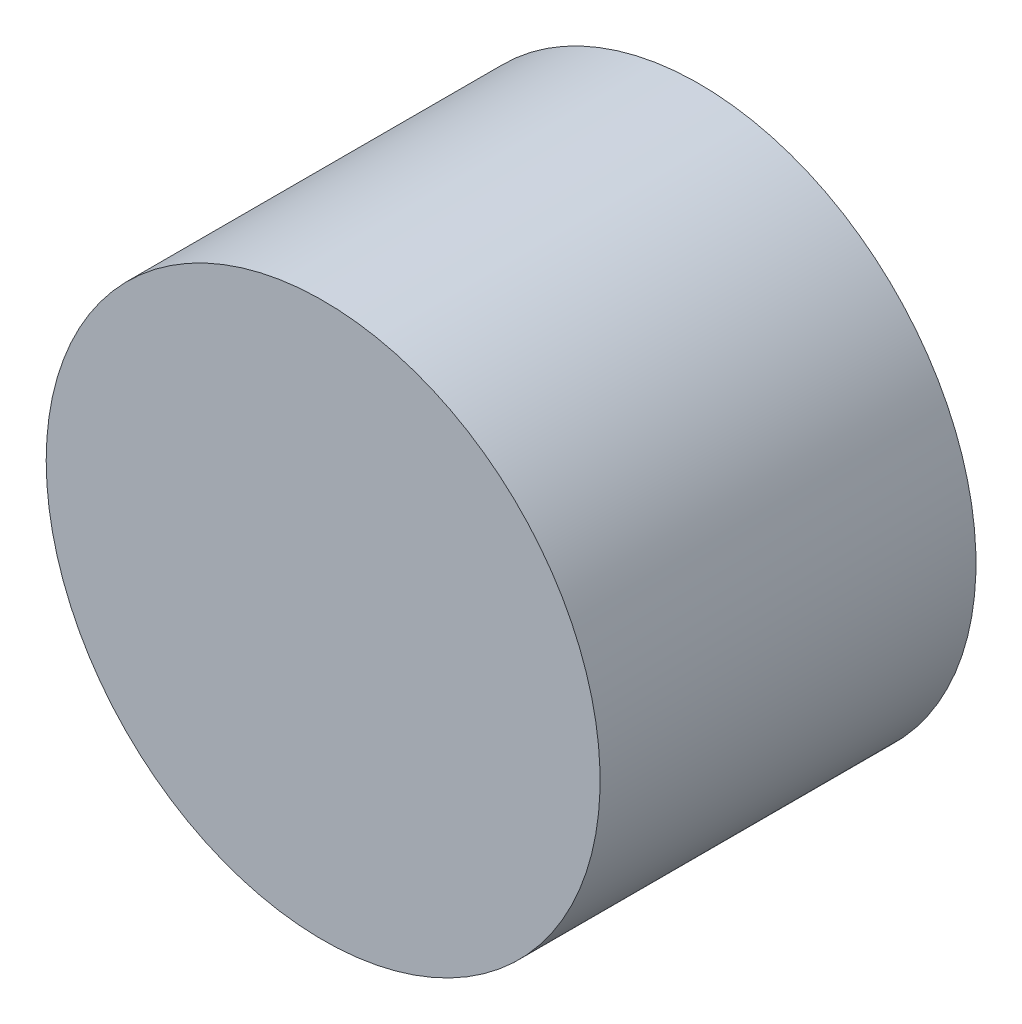
ISO-10303-21;
HEADER;
FILE_DESCRIPTION(('STEP AP214'),'2;1');
FILE_NAME('part.step','',(''),(''),'','','');
FILE_SCHEMA(('AUTOMOTIVE_DESIGN { 1 0 10303 214 1 1 1 1 }'));
ENDSEC;
DATA;
#1=APPLICATION_CONTEXT('core data for automotive mechanical design processes');
#2=APPLICATION_PROTOCOL_DEFINITION('international standard','automotive_design',2000,#1);
#3=PRODUCT_CONTEXT('',#1,'mechanical');
#4=PRODUCT('Part','Part','',(#3));
#5=PRODUCT_RELATED_PRODUCT_CATEGORY('part','',(#4));
#6=PRODUCT_DEFINITION_FORMATION('','',#4);
#7=PRODUCT_DEFINITION_CONTEXT('part definition',#1,'design');
#8=PRODUCT_DEFINITION('design','',#6,#7);
#9=PRODUCT_DEFINITION_SHAPE('','',#8);
#10=(LENGTH_UNIT() NAMED_UNIT(*) SI_UNIT(.MILLI.,.METRE.));
#11=(NAMED_UNIT(*) PLANE_ANGLE_UNIT() SI_UNIT($,.RADIAN.));
#12=(NAMED_UNIT(*) SI_UNIT($,.STERADIAN.) SOLID_ANGLE_UNIT());
#13=UNCERTAINTY_MEASURE_WITH_UNIT(LENGTH_MEASURE(1.E-05),#10,'distance_accuracy_value','');
#14=(GEOMETRIC_REPRESENTATION_CONTEXT(3) GLOBAL_UNCERTAINTY_ASSIGNED_CONTEXT((#13)) GLOBAL_UNIT_ASSIGNED_CONTEXT((#10,
#11,#12)) REPRESENTATION_CONTEXT('',''));
#15=CARTESIAN_POINT('',(0.,0.,0.));
#16=DIRECTION('',(0.,0.,1.));
#17=DIRECTION('',(1.,0.,0.));
#18=AXIS2_PLACEMENT_3D('',#15,#16,#17);
#19=CARTESIAN_POINT('',(0.,0.,3.8));
#20=DIRECTION('',(0.,0.,-1.));
#21=DIRECTION('',(-1.,0.,0.));
#22=AXIS2_PLACEMENT_3D('',#19,#20,#21);
#23=CYLINDRICAL_SURFACE('',#22,2.8);
#24=CARTESIAN_POINT('',(0.,0.,3.8));
#25=DIRECTION('',(0.,0.,1.));
#26=DIRECTION('',(1.,0.,0.));
#27=AXIS2_PLACEMENT_3D('',#24,#25,#26);
#28=CIRCLE('',#27,2.8);
#29=CARTESIAN_POINT('',(-2.8,0.,3.8));
#30=VERTEX_POINT('',#29);
#31=EDGE_CURVE('E10',#30,#30,#28,.T.);
#32=CARTESIAN_POINT('',(0.,0.,0.));
#33=DIRECTION('',(0.,0.,1.));
#34=DIRECTION('',(1.,0.,0.));
#35=AXIS2_PLACEMENT_3D('',#32,#33,#34);
#36=CIRCLE('',#35,2.8);
#37=CARTESIAN_POINT('',(-2.8,0.,0.));
#38=VERTEX_POINT('',#37);
#39=EDGE_CURVE('E38',#38,#38,#36,.T.);
#40=CARTESIAN_POINT('',(-2.8,0.,3.8));
#41=CARTESIAN_POINT('',(-2.8,0.,3.76041666666667));
#42=CARTESIAN_POINT('',(-2.8,0.,3.72083333333333));
#43=CARTESIAN_POINT('',(-2.8,0.,3.64166666666667));
#44=CARTESIAN_POINT('',(-2.8,0.,3.60208333333333));
#45=CARTESIAN_POINT('',(-2.8,0.,3.52291666666667));
#46=CARTESIAN_POINT('',(-2.8,0.,3.48333333333333));
#47=CARTESIAN_POINT('',(-2.8,0.,3.40416666666667));
#48=CARTESIAN_POINT('',(-2.8,0.,3.36458333333333));
#49=CARTESIAN_POINT('',(-2.8,0.,3.28541666666667));
#50=CARTESIAN_POINT('',(-2.8,0.,3.24583333333333));
#51=CARTESIAN_POINT('',(-2.8,0.,3.16666666666667));
#52=CARTESIAN_POINT('',(-2.8,0.,3.12708333333333));
#53=CARTESIAN_POINT('',(-2.8,0.,3.04791666666667));
#54=CARTESIAN_POINT('',(-2.8,0.,3.00833333333333));
#55=CARTESIAN_POINT('',(-2.8,0.,2.92916666666667));
#56=CARTESIAN_POINT('',(-2.8,0.,2.88958333333333));
#57=CARTESIAN_POINT('',(-2.8,0.,2.81041666666667));
#58=CARTESIAN_POINT('',(-2.8,0.,2.77083333333333));
#59=CARTESIAN_POINT('',(-2.8,0.,2.69166666666667));
#60=CARTESIAN_POINT('',(-2.8,0.,2.65208333333333));
#61=CARTESIAN_POINT('',(-2.8,0.,2.57291666666667));
#62=CARTESIAN_POINT('',(-2.8,0.,2.53333333333333));
#63=CARTESIAN_POINT('',(-2.8,0.,2.45416666666667));
#64=CARTESIAN_POINT('',(-2.8,0.,2.41458333333333));
#65=CARTESIAN_POINT('',(-2.8,0.,2.33541666666667));
#66=CARTESIAN_POINT('',(-2.8,0.,2.29583333333333));
#67=CARTESIAN_POINT('',(-2.8,0.,2.21666666666667));
#68=CARTESIAN_POINT('',(-2.8,0.,2.17708333333333));
#69=CARTESIAN_POINT('',(-2.8,0.,2.09791666666667));
#70=CARTESIAN_POINT('',(-2.8,0.,2.05833333333333));
#71=CARTESIAN_POINT('',(-2.8,0.,1.97916666666667));
#72=CARTESIAN_POINT('',(-2.8,0.,1.93958333333333));
#73=CARTESIAN_POINT('',(-2.8,0.,1.86041666666667));
#74=CARTESIAN_POINT('',(-2.8,0.,1.82083333333333));
#75=CARTESIAN_POINT('',(-2.8,0.,1.74166666666667));
#76=CARTESIAN_POINT('',(-2.8,0.,1.70208333333333));
#77=CARTESIAN_POINT('',(-2.8,0.,1.62291666666667));
#78=CARTESIAN_POINT('',(-2.8,0.,1.58333333333333));
#79=CARTESIAN_POINT('',(-2.8,0.,1.50416666666667));
#80=CARTESIAN_POINT('',(-2.8,0.,1.46458333333333));
#81=CARTESIAN_POINT('',(-2.8,0.,1.38541666666667));
#82=CARTESIAN_POINT('',(-2.8,0.,1.34583333333333));
#83=CARTESIAN_POINT('',(-2.8,0.,1.26666666666667));
#84=CARTESIAN_POINT('',(-2.8,0.,1.22708333333333));
#85=CARTESIAN_POINT('',(-2.8,0.,1.14791666666667));
#86=CARTESIAN_POINT('',(-2.8,0.,1.10833333333333));
#87=CARTESIAN_POINT('',(-2.8,0.,1.02916666666667));
#88=CARTESIAN_POINT('',(-2.8,0.,0.989583333333334));
#89=CARTESIAN_POINT('',(-2.8,0.,0.910416666666667));
#90=CARTESIAN_POINT('',(-2.8,0.,0.870833333333333));
#91=CARTESIAN_POINT('',(-2.8,0.,0.791666666666667));
#92=CARTESIAN_POINT('',(-2.8,0.,0.752083333333333));
#93=CARTESIAN_POINT('',(-2.8,0.,0.672916666666667));
#94=CARTESIAN_POINT('',(-2.8,0.,0.633333333333333));
#95=CARTESIAN_POINT('',(-2.8,0.,0.554166666666667));
#96=CARTESIAN_POINT('',(-2.8,0.,0.514583333333334));
#97=CARTESIAN_POINT('',(-2.8,0.,0.435416666666667));
#98=CARTESIAN_POINT('',(-2.8,0.,0.395833333333334));
#99=CARTESIAN_POINT('',(-2.8,0.,0.316666666666667));
#100=CARTESIAN_POINT('',(-2.8,0.,0.277083333333333));
#101=CARTESIAN_POINT('',(-2.8,0.,0.197916666666667));
#102=CARTESIAN_POINT('',(-2.8,0.,0.158333333333333));
#103=CARTESIAN_POINT('',(-2.8,0.,0.0791666666666666));
#104=CARTESIAN_POINT('',(-2.8,0.,0.0395833333333333));
#105=CARTESIAN_POINT('',(-2.8,0.,0.));
#106=B_SPLINE_CURVE_WITH_KNOTS('',3,(#40,#41,#42,#43,#44,#45,#46,#47,#48,#49,#50,#51,#52,#53,
#54,#55,#56,#57,#58,#59,#60,#61,#62,#63,#64,#65,#66,#67,#68,#69,#70,#71,#72,#73,#74,#75,#76,#77,
#78,#79,#80,#81,#82,#83,#84,#85,#86,#87,#88,#89,#90,#91,#92,#93,#94,#95,#96,#97,#98,#99,#100,
#101,#102,#103,#104,#105),.UNSPECIFIED.,.F.,.F.,(4,2,2,2,2,2,2,2,2,2,2,2,2,2,2,2,2,2,2,2,2,2,2,
2,2,2,2,2,2,2,2,2,4),(0.,0.11875,0.2375,0.35625,0.475,0.59375,0.7125,0.83125,0.95,1.06875,
1.1875,1.30625,1.425,1.54375,1.6625,1.78125,1.9,2.01875,2.1375,2.25625,2.375,2.49375,2.6125,
2.73125,2.85,2.96875,3.0875,3.20625,3.325,3.44375,3.5625,3.68125,3.8),.UNSPECIFIED.);
#107=EDGE_CURVE('BSEAM35',#30,#38,#106,.T.);
#108=ORIENTED_EDGE('',*,*,#31,.F.);
#109=ORIENTED_EDGE('',*,*,#39,.T.);
#110=ORIENTED_EDGE('',*,*,#107,.T.);
#111=ORIENTED_EDGE('',*,*,#107,.F.);
#112=EDGE_LOOP('',(#108,#110,#109,#111));
#113=FACE_BOUND('',#112,.T.);
#114=ADVANCED_FACE('F35',(#113),#23,.T.);
#115=CARTESIAN_POINT('',(0.,0.,3.8));
#116=DIRECTION('',(0.,0.,1.));
#117=DIRECTION('',(1.,0.,0.));
#118=AXIS2_PLACEMENT_3D('',#115,#116,#117);
#119=PLANE('',#118);
#120=ORIENTED_EDGE('',*,*,#31,.T.);
#121=EDGE_LOOP('',(#120));
#122=FACE_BOUND('',#121,.T.);
#123=ADVANCED_FACE('F50',(#122),#119,.T.);
#124=CARTESIAN_POINT('',(0.,0.,0.));
#125=DIRECTION('',(0.,0.,1.));
#126=DIRECTION('',(1.,0.,0.));
#127=AXIS2_PLACEMENT_3D('',#124,#125,#126);
#128=PLANE('',#127);
#129=ORIENTED_EDGE('',*,*,#39,.F.);
#130=EDGE_LOOP('',(#129));
#131=FACE_BOUND('',#130,.T.);
#132=ADVANCED_FACE('F48',(#131),#128,.F.);
#133=CLOSED_SHELL('',(#114,#123,#132));
#134=MANIFOLD_SOLID_BREP('B2',#133);
#135=ADVANCED_BREP_SHAPE_REPRESENTATION('',(#18,#134),#14);
#136=SHAPE_DEFINITION_REPRESENTATION(#9,#135);
ENDSEC;
END-ISO-10303-21;
